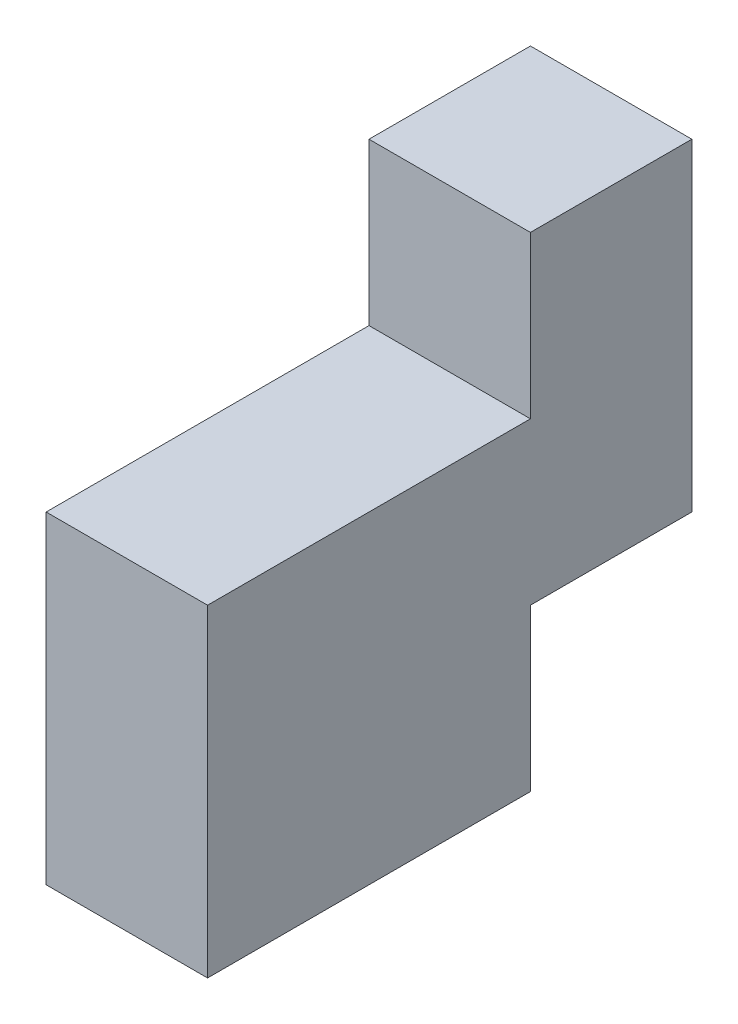
ISO-10303-21;
HEADER;
FILE_DESCRIPTION(('STEP AP214'),'2;1');
FILE_NAME('part.step','',(''),(''),'','','');
FILE_SCHEMA(('AUTOMOTIVE_DESIGN { 1 0 10303 214 1 1 1 1 }'));
ENDSEC;
DATA;
#1=APPLICATION_CONTEXT('core data for automotive mechanical design processes');
#2=APPLICATION_PROTOCOL_DEFINITION('international standard','automotive_design',2000,#1);
#3=PRODUCT_CONTEXT('',#1,'mechanical');
#4=PRODUCT('Part','Part','',(#3));
#5=PRODUCT_RELATED_PRODUCT_CATEGORY('part','',(#4));
#6=PRODUCT_DEFINITION_FORMATION('','',#4);
#7=PRODUCT_DEFINITION_CONTEXT('part definition',#1,'design');
#8=PRODUCT_DEFINITION('design','',#6,#7);
#9=PRODUCT_DEFINITION_SHAPE('','',#8);
#10=(LENGTH_UNIT() NAMED_UNIT(*) SI_UNIT(.MILLI.,.METRE.));
#11=(NAMED_UNIT(*) PLANE_ANGLE_UNIT() SI_UNIT($,.RADIAN.));
#12=(NAMED_UNIT(*) SI_UNIT($,.STERADIAN.) SOLID_ANGLE_UNIT());
#13=UNCERTAINTY_MEASURE_WITH_UNIT(LENGTH_MEASURE(1.E-05),#10,'distance_accuracy_value','');
#14=(GEOMETRIC_REPRESENTATION_CONTEXT(3) GLOBAL_UNCERTAINTY_ASSIGNED_CONTEXT((#13)) GLOBAL_UNIT_ASSIGNED_CONTEXT((#10,
#11,#12)) REPRESENTATION_CONTEXT('',''));
#15=CARTESIAN_POINT('',(0.,0.,0.));
#16=DIRECTION('',(0.,0.,1.));
#17=DIRECTION('',(1.,0.,0.));
#18=AXIS2_PLACEMENT_3D('',#15,#16,#17);
#19=CARTESIAN_POINT('',(0.,0.,0.));
#20=DIRECTION('',(0.,1.,0.));
#21=DIRECTION('',(0.,0.,1.));
#22=AXIS2_PLACEMENT_3D('',#19,#20,#21);
#23=PLANE('',#22);
#24=DIRECTION('',(0.,0.,-1.));
#25=VECTOR('',#24,1.);
#26=CARTESIAN_POINT('',(25.4,0.,0.));
#27=LINE('',#26,#25);
#28=CARTESIAN_POINT('',(25.4,0.,25.4));
#29=VERTEX_POINT('',#28);
#30=CARTESIAN_POINT('',(25.4,0.,0.));
#31=VERTEX_POINT('',#30);
#32=EDGE_CURVE('E79',#29,#31,#27,.T.);
#33=ORIENTED_EDGE('',*,*,#32,.F.);
#34=DIRECTION('',(1.,0.,0.));
#35=VECTOR('',#34,1.);
#36=CARTESIAN_POINT('',(25.4,0.,25.4));
#37=LINE('',#36,#35);
#38=CARTESIAN_POINT('',(0.,0.,25.4));
#39=VERTEX_POINT('',#38);
#40=EDGE_CURVE('E94',#39,#29,#37,.T.);
#41=ORIENTED_EDGE('',*,*,#40,.F.);
#42=DIRECTION('',(0.,0.,1.));
#43=VECTOR('',#42,1.);
#44=CARTESIAN_POINT('',(0.,0.,0.));
#45=LINE('',#44,#43);
#46=CARTESIAN_POINT('',(0.,0.,0.));
#47=VERTEX_POINT('',#46);
#48=EDGE_CURVE('E86',#47,#39,#45,.T.);
#49=ORIENTED_EDGE('',*,*,#48,.F.);
#50=DIRECTION('',(-1.,0.,0.));
#51=VECTOR('',#50,1.);
#52=CARTESIAN_POINT('',(0.,0.,0.));
#53=LINE('',#52,#51);
#54=EDGE_CURVE('E67',#31,#47,#53,.T.);
#55=ORIENTED_EDGE('',*,*,#54,.F.);
#56=EDGE_LOOP('',(#33,#41,#49,#55));
#57=FACE_BOUND('',#56,.T.);
#58=ADVANCED_FACE('F32',(#57),#23,.F.);
#59=CARTESIAN_POINT('',(0.,25.4,0.));
#60=DIRECTION('',(1.,0.,0.));
#61=DIRECTION('',(0.,0.,-1.));
#62=AXIS2_PLACEMENT_3D('',#59,#60,#61);
#63=PLANE('',#62);
#64=ORIENTED_EDGE('',*,*,#48,.T.);
#65=DIRECTION('',(0.,1.,0.));
#66=VECTOR('',#65,1.);
#67=CARTESIAN_POINT('',(0.,0.,25.4));
#68=LINE('',#67,#66);
#69=CARTESIAN_POINT('',(0.,-25.4,25.4));
#70=VERTEX_POINT('',#69);
#71=EDGE_CURVE('E173',#70,#39,#68,.T.);
#72=ORIENTED_EDGE('',*,*,#71,.F.);
#73=DIRECTION('',(0.,0.,-1.));
#74=VECTOR('',#73,1.);
#75=CARTESIAN_POINT('',(0.,-25.4,76.2));
#76=LINE('',#75,#74);
#77=CARTESIAN_POINT('',(0.,-25.4,76.2));
#78=VERTEX_POINT('',#77);
#79=EDGE_CURVE('E130',#78,#70,#76,.T.);
#80=ORIENTED_EDGE('',*,*,#79,.F.);
#81=DIRECTION('',(0.,-1.,0.));
#82=VECTOR('',#81,1.);
#83=CARTESIAN_POINT('',(0.,25.4,76.2));
#84=LINE('',#83,#82);
#85=CARTESIAN_POINT('',(0.,25.4,76.2));
#86=VERTEX_POINT('',#85);
#87=EDGE_CURVE('E11',#86,#78,#84,.T.);
#88=ORIENTED_EDGE('',*,*,#87,.F.);
#89=DIRECTION('',(0.,0.,1.));
#90=VECTOR('',#89,1.);
#91=CARTESIAN_POINT('',(0.,25.4,0.));
#92=LINE('',#91,#90);
#93=CARTESIAN_POINT('',(0.,25.4,25.4));
#94=VERTEX_POINT('',#93);
#95=EDGE_CURVE('E78',#94,#86,#92,.T.);
#96=ORIENTED_EDGE('',*,*,#95,.F.);
#97=DIRECTION('',(0.,-1.,0.));
#98=VECTOR('',#97,1.);
#99=CARTESIAN_POINT('',(0.,50.8,25.4));
#100=LINE('',#99,#98);
#101=CARTESIAN_POINT('',(0.,50.8,25.4));
#102=VERTEX_POINT('',#101);
#103=EDGE_CURVE('E95',#102,#94,#100,.T.);
#104=ORIENTED_EDGE('',*,*,#103,.F.);
#105=DIRECTION('',(0.,0.,1.));
#106=VECTOR('',#105,1.);
#107=CARTESIAN_POINT('',(0.,50.8,0.));
#108=LINE('',#107,#106);
#109=CARTESIAN_POINT('',(0.,50.8,0.));
#110=VERTEX_POINT('',#109);
#111=EDGE_CURVE('E89',#110,#102,#108,.T.);
#112=ORIENTED_EDGE('',*,*,#111,.F.);
#113=DIRECTION('',(0.,-1.,0.));
#114=VECTOR('',#113,1.);
#115=CARTESIAN_POINT('',(0.,25.4,0.));
#116=LINE('',#115,#114);
#117=EDGE_CURVE('E71',#110,#47,#116,.T.);
#118=ORIENTED_EDGE('',*,*,#117,.T.);
#119=EDGE_LOOP('',(#64,#72,#80,#88,#96,#104,#112,#118));
#120=FACE_BOUND('',#119,.T.);
#121=ADVANCED_FACE('F34',(#120),#63,.F.);
#122=CARTESIAN_POINT('',(0.,25.4,76.2));
#123=DIRECTION('',(0.,0.,-1.));
#124=DIRECTION('',(-1.,0.,0.));
#125=AXIS2_PLACEMENT_3D('',#122,#123,#124);
#126=PLANE('',#125);
#127=ORIENTED_EDGE('',*,*,#87,.T.);
#128=DIRECTION('',(-1.,0.,0.));
#129=VECTOR('',#128,1.);
#130=CARTESIAN_POINT('',(0.,-25.4,76.2));
#131=LINE('',#130,#129);
#132=CARTESIAN_POINT('',(25.4,-25.4,76.2));
#133=VERTEX_POINT('',#132);
#134=EDGE_CURVE('E125',#133,#78,#131,.T.);
#135=ORIENTED_EDGE('',*,*,#134,.F.);
#136=DIRECTION('',(0.,-1.,0.));
#137=VECTOR('',#136,1.);
#138=CARTESIAN_POINT('',(25.4,25.4,76.2));
#139=LINE('',#138,#137);
#140=CARTESIAN_POINT('',(25.4,25.4,76.2));
#141=VERTEX_POINT('',#140);
#142=EDGE_CURVE('E40',#141,#133,#139,.T.);
#143=ORIENTED_EDGE('',*,*,#142,.F.);
#144=DIRECTION('',(1.,0.,0.));
#145=VECTOR('',#144,1.);
#146=CARTESIAN_POINT('',(0.,25.4,76.2));
#147=LINE('',#146,#145);
#148=EDGE_CURVE('E53',#86,#141,#147,.T.);
#149=ORIENTED_EDGE('',*,*,#148,.F.);
#150=EDGE_LOOP('',(#127,#135,#143,#149));
#151=FACE_BOUND('',#150,.T.);
#152=ADVANCED_FACE('F132',(#151),#126,.F.);
#153=CARTESIAN_POINT('',(25.4,25.4,0.));
#154=DIRECTION('',(-1.,0.,0.));
#155=DIRECTION('',(0.,0.,1.));
#156=AXIS2_PLACEMENT_3D('',#153,#154,#155);
#157=PLANE('',#156);
#158=DIRECTION('',(0.,-1.,0.));
#159=VECTOR('',#158,1.);
#160=CARTESIAN_POINT('',(25.4,0.,25.4));
#161=LINE('',#160,#159);
#162=CARTESIAN_POINT('',(25.4,-25.4,25.4));
#163=VERTEX_POINT('',#162);
#164=EDGE_CURVE('E174',#29,#163,#161,.T.);
#165=ORIENTED_EDGE('',*,*,#164,.F.);
#166=ORIENTED_EDGE('',*,*,#32,.T.);
#167=DIRECTION('',(0.,-1.,0.));
#168=VECTOR('',#167,1.);
#169=CARTESIAN_POINT('',(25.4,25.4,0.));
#170=LINE('',#169,#168);
#171=CARTESIAN_POINT('',(25.4,50.8,0.));
#172=VERTEX_POINT('',#171);
#173=EDGE_CURVE('E74',#172,#31,#170,.T.);
#174=ORIENTED_EDGE('',*,*,#173,.F.);
#175=DIRECTION('',(0.,0.,-1.));
#176=VECTOR('',#175,1.);
#177=CARTESIAN_POINT('',(25.4,50.8,0.));
#178=LINE('',#177,#176);
#179=CARTESIAN_POINT('',(25.4,50.8,25.4));
#180=VERTEX_POINT('',#179);
#181=EDGE_CURVE('E142',#180,#172,#178,.T.);
#182=ORIENTED_EDGE('',*,*,#181,.F.);
#183=DIRECTION('',(0.,-1.,0.));
#184=VECTOR('',#183,1.);
#185=CARTESIAN_POINT('',(25.4,50.8,25.4));
#186=LINE('',#185,#184);
#187=CARTESIAN_POINT('',(25.4,25.4,25.4));
#188=VERTEX_POINT('',#187);
#189=EDGE_CURVE('E99',#180,#188,#186,.T.);
#190=ORIENTED_EDGE('',*,*,#189,.T.);
#191=DIRECTION('',(0.,0.,-1.));
#192=VECTOR('',#191,1.);
#193=CARTESIAN_POINT('',(25.4,25.4,0.));
#194=LINE('',#193,#192);
#195=EDGE_CURVE('E90',#141,#188,#194,.T.);
#196=ORIENTED_EDGE('',*,*,#195,.F.);
#197=ORIENTED_EDGE('',*,*,#142,.T.);
#198=DIRECTION('',(0.,0.,1.));
#199=VECTOR('',#198,1.);
#200=CARTESIAN_POINT('',(25.4,-25.4,76.2));
#201=LINE('',#200,#199);
#202=EDGE_CURVE('E113',#163,#133,#201,.T.);
#203=ORIENTED_EDGE('',*,*,#202,.F.);
#204=EDGE_LOOP('',(#165,#166,#174,#182,#190,#196,#197,#203));
#205=FACE_BOUND('',#204,.T.);
#206=ADVANCED_FACE('F111',(#205),#157,.F.);
#207=CARTESIAN_POINT('',(0.,25.4,0.));
#208=DIRECTION('',(0.,0.,1.));
#209=DIRECTION('',(1.,0.,0.));
#210=AXIS2_PLACEMENT_3D('',#207,#208,#209);
#211=PLANE('',#210);
#212=ORIENTED_EDGE('',*,*,#54,.T.);
#213=ORIENTED_EDGE('',*,*,#117,.F.);
#214=DIRECTION('',(-1.,0.,0.));
#215=VECTOR('',#214,1.);
#216=CARTESIAN_POINT('',(0.,50.8,0.));
#217=LINE('',#216,#215);
#218=EDGE_CURVE('E145',#172,#110,#217,.T.);
#219=ORIENTED_EDGE('',*,*,#218,.F.);
#220=ORIENTED_EDGE('',*,*,#173,.T.);
#221=EDGE_LOOP('',(#212,#213,#219,#220));
#222=FACE_BOUND('',#221,.T.);
#223=ADVANCED_FACE('F69',(#222),#211,.F.);
#224=CARTESIAN_POINT('',(0.,25.4,0.));
#225=DIRECTION('',(0.,1.,0.));
#226=DIRECTION('',(0.,0.,1.));
#227=AXIS2_PLACEMENT_3D('',#224,#225,#226);
#228=PLANE('',#227);
#229=DIRECTION('',(1.,0.,0.));
#230=VECTOR('',#229,1.);
#231=CARTESIAN_POINT('',(0.,25.4,25.4));
#232=LINE('',#231,#230);
#233=EDGE_CURVE('E47',#94,#188,#232,.T.);
#234=ORIENTED_EDGE('',*,*,#233,.F.);
#235=ORIENTED_EDGE('',*,*,#95,.T.);
#236=ORIENTED_EDGE('',*,*,#148,.T.);
#237=ORIENTED_EDGE('',*,*,#195,.T.);
#238=EDGE_LOOP('',(#234,#235,#236,#237));
#239=FACE_BOUND('',#238,.T.);
#240=ADVANCED_FACE('F149',(#239),#228,.T.);
#241=CARTESIAN_POINT('',(0.,50.8,25.4));
#242=DIRECTION('',(0.,0.,-1.));
#243=DIRECTION('',(-1.,0.,0.));
#244=AXIS2_PLACEMENT_3D('',#241,#242,#243);
#245=PLANE('',#244);
#246=ORIENTED_EDGE('',*,*,#233,.T.);
#247=ORIENTED_EDGE('',*,*,#189,.F.);
#248=DIRECTION('',(1.,0.,0.));
#249=VECTOR('',#248,1.);
#250=CARTESIAN_POINT('',(0.,50.8,25.4));
#251=LINE('',#250,#249);
#252=EDGE_CURVE('E139',#102,#180,#251,.T.);
#253=ORIENTED_EDGE('',*,*,#252,.F.);
#254=ORIENTED_EDGE('',*,*,#103,.T.);
#255=EDGE_LOOP('',(#246,#247,#253,#254));
#256=FACE_BOUND('',#255,.T.);
#257=ADVANCED_FACE('F153',(#256),#245,.F.);
#258=CARTESIAN_POINT('',(0.,50.8,0.));
#259=DIRECTION('',(0.,1.,0.));
#260=DIRECTION('',(0.,0.,1.));
#261=AXIS2_PLACEMENT_3D('',#258,#259,#260);
#262=PLANE('',#261);
#263=ORIENTED_EDGE('',*,*,#111,.T.);
#264=ORIENTED_EDGE('',*,*,#252,.T.);
#265=ORIENTED_EDGE('',*,*,#181,.T.);
#266=ORIENTED_EDGE('',*,*,#218,.T.);
#267=EDGE_LOOP('',(#263,#264,#265,#266));
#268=FACE_BOUND('',#267,.T.);
#269=ADVANCED_FACE('F160',(#268),#262,.T.);
#270=CARTESIAN_POINT('',(0.,-25.4,0.));
#271=DIRECTION('',(0.,-1.,0.));
#272=DIRECTION('',(0.,0.,-1.));
#273=AXIS2_PLACEMENT_3D('',#270,#271,#272);
#274=PLANE('',#273);
#275=ORIENTED_EDGE('',*,*,#79,.T.);
#276=DIRECTION('',(-1.,0.,0.));
#277=VECTOR('',#276,1.);
#278=CARTESIAN_POINT('',(25.4,-25.4,25.4));
#279=LINE('',#278,#277);
#280=EDGE_CURVE('E128',#163,#70,#279,.T.);
#281=ORIENTED_EDGE('',*,*,#280,.F.);
#282=ORIENTED_EDGE('',*,*,#202,.T.);
#283=ORIENTED_EDGE('',*,*,#134,.T.);
#284=EDGE_LOOP('',(#275,#281,#282,#283));
#285=FACE_BOUND('',#284,.T.);
#286=ADVANCED_FACE('F124',(#285),#274,.T.);
#287=CARTESIAN_POINT('',(0.,0.,25.4));
#288=DIRECTION('',(0.,0.,-1.));
#289=DIRECTION('',(-1.,0.,0.));
#290=AXIS2_PLACEMENT_3D('',#287,#288,#289);
#291=PLANE('',#290);
#292=ORIENTED_EDGE('',*,*,#164,.T.);
#293=ORIENTED_EDGE('',*,*,#280,.T.);
#294=ORIENTED_EDGE('',*,*,#71,.T.);
#295=ORIENTED_EDGE('',*,*,#40,.T.);
#296=EDGE_LOOP('',(#292,#293,#294,#295));
#297=FACE_BOUND('',#296,.T.);
#298=ADVANCED_FACE('F172',(#297),#291,.T.);
#299=CLOSED_SHELL('',(#58,#121,#152,#206,#223,#240,#257,#269,#286,#298));
#300=MANIFOLD_SOLID_BREP('B2',#299);
#301=ADVANCED_BREP_SHAPE_REPRESENTATION('',(#18,#300),#14);
#302=SHAPE_DEFINITION_REPRESENTATION(#9,#301);
ENDSEC;
END-ISO-10303-21;
